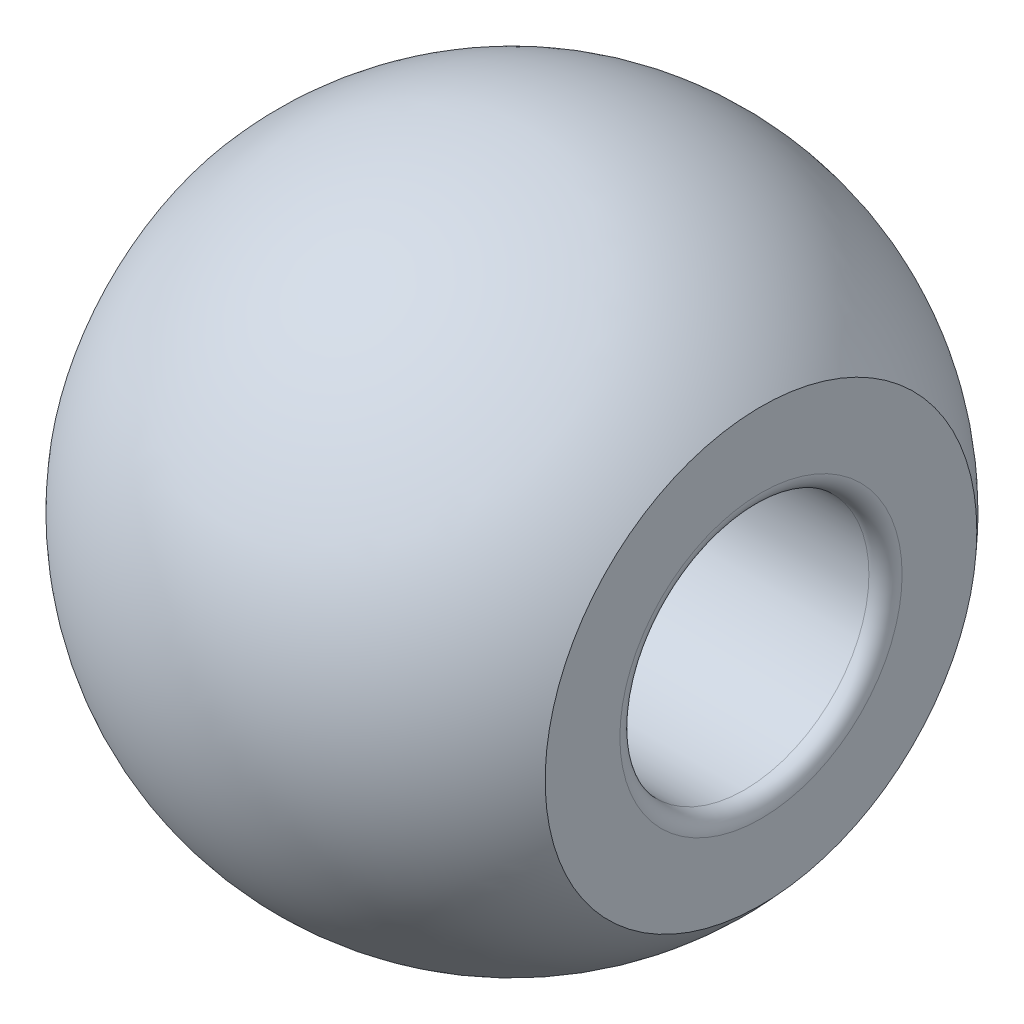
ISO-10303-21;
HEADER;
FILE_DESCRIPTION(('STEP AP214'),'2;1');
FILE_NAME('part.step','',(''),(''),'','','');
FILE_SCHEMA(('AUTOMOTIVE_DESIGN { 1 0 10303 214 1 1 1 1 }'));
ENDSEC;
DATA;
#1=APPLICATION_CONTEXT('core data for automotive mechanical design processes');
#2=APPLICATION_PROTOCOL_DEFINITION('international standard','automotive_design',2000,#1);
#3=PRODUCT_CONTEXT('',#1,'mechanical');
#4=PRODUCT('Part','Part','',(#3));
#5=PRODUCT_RELATED_PRODUCT_CATEGORY('part','',(#4));
#6=PRODUCT_DEFINITION_FORMATION('','',#4);
#7=PRODUCT_DEFINITION_CONTEXT('part definition',#1,'design');
#8=PRODUCT_DEFINITION('design','',#6,#7);
#9=PRODUCT_DEFINITION_SHAPE('','',#8);
#10=(LENGTH_UNIT() NAMED_UNIT(*) SI_UNIT(.MILLI.,.METRE.));
#11=(NAMED_UNIT(*) PLANE_ANGLE_UNIT() SI_UNIT($,.RADIAN.));
#12=(NAMED_UNIT(*) SI_UNIT($,.STERADIAN.) SOLID_ANGLE_UNIT());
#13=UNCERTAINTY_MEASURE_WITH_UNIT(LENGTH_MEASURE(1.E-05),#10,'distance_accuracy_value','');
#14=(GEOMETRIC_REPRESENTATION_CONTEXT(3) GLOBAL_UNCERTAINTY_ASSIGNED_CONTEXT((#13)) GLOBAL_UNIT_ASSIGNED_CONTEXT((#10,
#11,#12)) REPRESENTATION_CONTEXT('',''));
#15=CARTESIAN_POINT('',(0.,0.,0.));
#16=DIRECTION('',(0.,0.,1.));
#17=DIRECTION('',(1.,0.,0.));
#18=AXIS2_PLACEMENT_3D('',#15,#16,#17);
#19=CARTESIAN_POINT('',(0.,2.6,0.));
#20=DIRECTION('',(-1.,0.,0.));
#21=DIRECTION('',(0.,0.,1.));
#22=AXIS2_PLACEMENT_3D('',#19,#20,#21);
#23=PLANE('',#22);
#24=CARTESIAN_POINT('',(0.,0.,0.));
#25=DIRECTION('',(1.,0.,0.));
#26=DIRECTION('',(0.,0.,-1.));
#27=AXIS2_PLACEMENT_3D('',#24,#25,#26);
#28=CIRCLE('',#27,1.7);
#29=CARTESIAN_POINT('',(0.,0.,-1.7));
#30=VERTEX_POINT('',#29);
#31=EDGE_CURVE('E38',#30,#30,#28,.T.);
#32=ORIENTED_EDGE('',*,*,#31,.T.);
#33=EDGE_LOOP('',(#32));
#34=FACE_BOUND('',#33,.T.);
#35=CARTESIAN_POINT('',(0.,0.,0.));
#36=DIRECTION('',(1.,0.,0.));
#37=DIRECTION('',(0.,0.,-1.));
#38=AXIS2_PLACEMENT_3D('',#35,#36,#37);
#39=CIRCLE('',#38,2.6);
#40=CARTESIAN_POINT('',(0.,0.,-2.6));
#41=VERTEX_POINT('',#40);
#42=EDGE_CURVE('E35',#41,#41,#39,.T.);
#43=ORIENTED_EDGE('',*,*,#42,.F.);
#44=EDGE_LOOP('',(#43));
#45=FACE_BOUND('',#44,.T.);
#46=ADVANCED_FACE('F15',(#34,#45),#23,.T.);
#47=CARTESIAN_POINT('',(0.200000000000016,0.,0.));
#48=DIRECTION('',(1.,0.,0.));
#49=DIRECTION('',(0.,0.,-1.));
#50=AXIS2_PLACEMENT_3D('',#47,#48,#49);
#51=TOROIDAL_SURFACE('',#50,1.7,0.200000000000016);
#52=CARTESIAN_POINT('',(0.2,0.,0.));
#53=DIRECTION('',(1.,0.,0.));
#54=DIRECTION('',(0.,0.,-1.));
#55=AXIS2_PLACEMENT_3D('',#52,#53,#54);
#56=CIRCLE('',#55,1.5);
#57=CARTESIAN_POINT('',(0.2,0.,-1.5));
#58=VERTEX_POINT('',#57);
#59=EDGE_CURVE('E30',#58,#58,#56,.T.);
#60=ORIENTED_EDGE('',*,*,#59,.T.);
#61=EDGE_LOOP('',(#60));
#62=FACE_BOUND('',#61,.T.);
#63=ORIENTED_EDGE('',*,*,#31,.F.);
#64=EDGE_LOOP('',(#63));
#65=FACE_BOUND('',#64,.T.);
#66=ADVANCED_FACE('F44',(#62,#65),#51,.T.);
#67=CARTESIAN_POINT('',(3.,0.,0.));
#68=DIRECTION('',(1.,0.,0.));
#69=DIRECTION('',(0.,0.,-1.));
#70=AXIS2_PLACEMENT_3D('',#67,#68,#69);
#71=DEGENERATE_TOROIDAL_SURFACE('',#70,0.000173071162869448,3.97000000000007,.F.);
#72=ORIENTED_EDGE('',*,*,#42,.T.);
#73=EDGE_LOOP('',(#72));
#74=FACE_BOUND('',#73,.T.);
#75=CARTESIAN_POINT('',(6.,0.,0.));
#76=DIRECTION('',(1.,0.,0.));
#77=DIRECTION('',(0.,0.,-1.));
#78=AXIS2_PLACEMENT_3D('',#75,#76,#77);
#79=CIRCLE('',#78,2.6);
#80=CARTESIAN_POINT('',(6.,0.,-2.6));
#81=VERTEX_POINT('',#80);
#82=EDGE_CURVE('E26',#81,#81,#79,.T.);
#83=ORIENTED_EDGE('',*,*,#82,.F.);
#84=EDGE_LOOP('',(#83));
#85=FACE_BOUND('',#84,.T.);
#86=ADVANCED_FACE('F46',(#74,#85),#71,.F.);
#87=CARTESIAN_POINT('',(6.,0.,0.));
#88=DIRECTION('',(1.,0.,0.));
#89=DIRECTION('',(0.,0.,-1.));
#90=AXIS2_PLACEMENT_3D('',#87,#88,#89);
#91=CYLINDRICAL_SURFACE('',#90,1.5);
#92=CARTESIAN_POINT('',(5.8,0.,0.));
#93=DIRECTION('',(1.,0.,0.));
#94=DIRECTION('',(0.,0.,-1.));
#95=AXIS2_PLACEMENT_3D('',#92,#93,#94);
#96=CIRCLE('',#95,1.5);
#97=CARTESIAN_POINT('',(5.8,0.,-1.5));
#98=VERTEX_POINT('',#97);
#99=EDGE_CURVE('E22',#98,#98,#96,.T.);
#100=ORIENTED_EDGE('',*,*,#99,.T.);
#101=EDGE_LOOP('',(#100));
#102=FACE_BOUND('',#101,.T.);
#103=ORIENTED_EDGE('',*,*,#59,.F.);
#104=EDGE_LOOP('',(#103));
#105=FACE_BOUND('',#104,.T.);
#106=ADVANCED_FACE('F54',(#102,#105),#91,.F.);
#107=CARTESIAN_POINT('',(6.,1.7,0.));
#108=DIRECTION('',(1.,0.,0.));
#109=DIRECTION('',(0.,0.,-1.));
#110=AXIS2_PLACEMENT_3D('',#107,#108,#109);
#111=PLANE('',#110);
#112=ORIENTED_EDGE('',*,*,#82,.T.);
#113=EDGE_LOOP('',(#112));
#114=FACE_BOUND('',#113,.T.);
#115=CARTESIAN_POINT('',(6.,0.,0.));
#116=DIRECTION('',(1.,0.,0.));
#117=DIRECTION('',(0.,0.,-1.));
#118=AXIS2_PLACEMENT_3D('',#115,#116,#117);
#119=CIRCLE('',#118,1.69999988722275);
#120=CARTESIAN_POINT('',(6.,0.,-1.69999988722275));
#121=VERTEX_POINT('',#120);
#122=EDGE_CURVE('E10',#121,#121,#119,.T.);
#123=ORIENTED_EDGE('',*,*,#122,.F.);
#124=EDGE_LOOP('',(#123));
#125=FACE_BOUND('',#124,.T.);
#126=ADVANCED_FACE('F60',(#114,#125),#111,.T.);
#127=CARTESIAN_POINT('',(5.8,0.,0.));
#128=DIRECTION('',(1.,0.,0.));
#129=DIRECTION('',(0.,0.,-1.));
#130=AXIS2_PLACEMENT_3D('',#127,#128,#129);
#131=TOROIDAL_SURFACE('',#130,1.70000000000003,0.200000000000032);
#132=ORIENTED_EDGE('',*,*,#122,.T.);
#133=EDGE_LOOP('',(#132));
#134=FACE_BOUND('',#133,.T.);
#135=ORIENTED_EDGE('',*,*,#99,.F.);
#136=EDGE_LOOP('',(#135));
#137=FACE_BOUND('',#136,.T.);
#138=ADVANCED_FACE('F17',(#134,#137),#131,.T.);
#139=CLOSED_SHELL('',(#46,#66,#86,#106,#126,#138));
#140=MANIFOLD_SOLID_BREP('B1',#139);
#141=ADVANCED_BREP_SHAPE_REPRESENTATION('',(#18,#140),#14);
#142=SHAPE_DEFINITION_REPRESENTATION(#9,#141);
ENDSEC;
END-ISO-10303-21;
